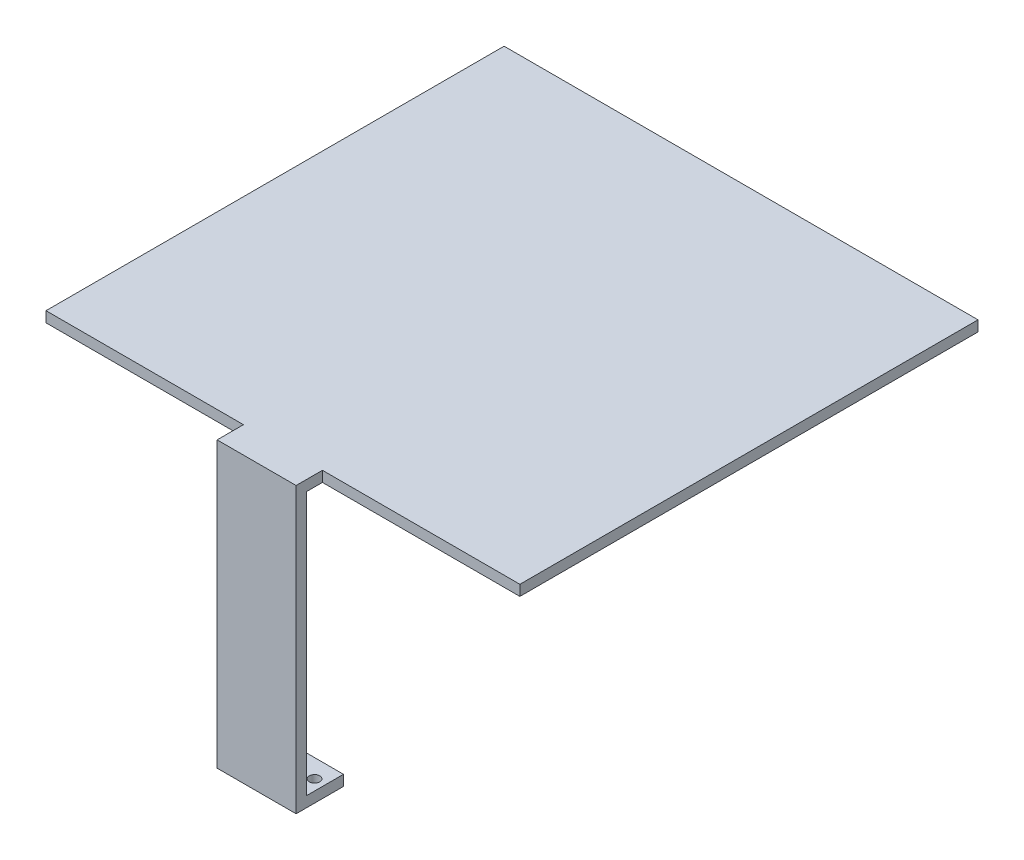
ISO-10303-21;
HEADER;
FILE_DESCRIPTION(('STEP AP214'),'2;1');
FILE_NAME('part.step','',(''),(''),'','','');
FILE_SCHEMA(('AUTOMOTIVE_DESIGN { 1 0 10303 214 1 1 1 1 }'));
ENDSEC;
DATA;
#1=APPLICATION_CONTEXT('core data for automotive mechanical design processes');
#2=APPLICATION_PROTOCOL_DEFINITION('international standard','automotive_design',2000,#1);
#3=PRODUCT_CONTEXT('',#1,'mechanical');
#4=PRODUCT('Part','Part','',(#3));
#5=PRODUCT_RELATED_PRODUCT_CATEGORY('part','',(#4));
#6=PRODUCT_DEFINITION_FORMATION('','',#4);
#7=PRODUCT_DEFINITION_CONTEXT('part definition',#1,'design');
#8=PRODUCT_DEFINITION('design','',#6,#7);
#9=PRODUCT_DEFINITION_SHAPE('','',#8);
#10=(LENGTH_UNIT() NAMED_UNIT(*) SI_UNIT(.MILLI.,.METRE.));
#11=(NAMED_UNIT(*) PLANE_ANGLE_UNIT() SI_UNIT($,.RADIAN.));
#12=(NAMED_UNIT(*) SI_UNIT($,.STERADIAN.) SOLID_ANGLE_UNIT());
#13=UNCERTAINTY_MEASURE_WITH_UNIT(LENGTH_MEASURE(1.E-05),#10,'distance_accuracy_value','');
#14=(GEOMETRIC_REPRESENTATION_CONTEXT(3) GLOBAL_UNCERTAINTY_ASSIGNED_CONTEXT((#13)) GLOBAL_UNIT_ASSIGNED_CONTEXT((#10,
#11,#12)) REPRESENTATION_CONTEXT('',''));
#15=CARTESIAN_POINT('',(0.,0.,0.));
#16=DIRECTION('',(0.,0.,1.));
#17=DIRECTION('',(1.,0.,0.));
#18=AXIS2_PLACEMENT_3D('',#15,#16,#17);
#19=CARTESIAN_POINT('',(7.5,-2.,9.));
#20=DIRECTION('',(0.,0.,1.));
#21=DIRECTION('',(1.,0.,0.));
#22=AXIS2_PLACEMENT_3D('',#19,#20,#21);
#23=PLANE('',#22);
#24=DIRECTION('',(0.,1.,0.));
#25=VECTOR('',#24,1.);
#26=CARTESIAN_POINT('',(-7.5,-2.,9.));
#27=LINE('',#26,#25);
#28=CARTESIAN_POINT('',(-7.5,-2.,9.));
#29=VERTEX_POINT('',#28);
#30=CARTESIAN_POINT('',(-7.5,52.,9.));
#31=VERTEX_POINT('',#30);
#32=EDGE_CURVE('E168',#29,#31,#27,.T.);
#33=ORIENTED_EDGE('',*,*,#32,.F.);
#34=DIRECTION('',(-1.,0.,0.));
#35=VECTOR('',#34,1.);
#36=CARTESIAN_POINT('',(7.5,-2.,9.));
#37=LINE('',#36,#35);
#38=CARTESIAN_POINT('',(7.5,-2.,9.));
#39=VERTEX_POINT('',#38);
#40=EDGE_CURVE('E40',#39,#29,#37,.T.);
#41=ORIENTED_EDGE('',*,*,#40,.F.);
#42=DIRECTION('',(0.,1.,0.));
#43=VECTOR('',#42,1.);
#44=CARTESIAN_POINT('',(7.5,-2.,9.));
#45=LINE('',#44,#43);
#46=CARTESIAN_POINT('',(7.5,52.,9.));
#47=VERTEX_POINT('',#46);
#48=EDGE_CURVE('E169',#39,#47,#45,.T.);
#49=ORIENTED_EDGE('',*,*,#48,.T.);
#50=DIRECTION('',(-1.,0.,0.));
#51=VECTOR('',#50,1.);
#52=CARTESIAN_POINT('',(7.5,52.,9.));
#53=LINE('',#52,#51);
#54=EDGE_CURVE('E187',#47,#31,#53,.T.);
#55=ORIENTED_EDGE('',*,*,#54,.T.);
#56=EDGE_LOOP('',(#33,#41,#49,#55));
#57=FACE_BOUND('',#56,.T.);
#58=ADVANCED_FACE('F33',(#57),#23,.T.);
#59=CARTESIAN_POINT('',(7.5,-2.,0.));
#60=DIRECTION('',(0.,-1.,0.));
#61=DIRECTION('',(0.,0.,-1.));
#62=AXIS2_PLACEMENT_3D('',#59,#60,#61);
#63=PLANE('',#62);
#64=CARTESIAN_POINT('',(-5.5,-2.,3.5));
#65=DIRECTION('',(0.,1.,0.));
#66=DIRECTION('',(0.,0.,1.));
#67=AXIS2_PLACEMENT_3D('',#64,#65,#66);
#68=CIRCLE('',#67,1.);
#69=CARTESIAN_POINT('',(-5.5,-2.,4.5));
#70=VERTEX_POINT('',#69);
#71=EDGE_CURVE('E161',#70,#70,#68,.T.);
#72=ORIENTED_EDGE('',*,*,#71,.T.);
#73=EDGE_LOOP('',(#72));
#74=FACE_BOUND('',#73,.T.);
#75=CARTESIAN_POINT('',(5.5,-2.,3.5));
#76=DIRECTION('',(0.,1.,0.));
#77=DIRECTION('',(0.,0.,-1.));
#78=AXIS2_PLACEMENT_3D('',#75,#76,#77);
#79=CIRCLE('',#78,1.);
#80=CARTESIAN_POINT('',(5.5,-2.,2.5));
#81=VERTEX_POINT('',#80);
#82=EDGE_CURVE('E398',#81,#81,#79,.T.);
#83=ORIENTED_EDGE('',*,*,#82,.T.);
#84=EDGE_LOOP('',(#83));
#85=FACE_BOUND('',#84,.T.);
#86=DIRECTION('',(0.,0.,1.));
#87=VECTOR('',#86,1.);
#88=CARTESIAN_POINT('',(-7.5,-2.,0.));
#89=LINE('',#88,#87);
#90=CARTESIAN_POINT('',(-7.5,-2.,0.));
#91=VERTEX_POINT('',#90);
#92=EDGE_CURVE('E173',#91,#29,#89,.T.);
#93=ORIENTED_EDGE('',*,*,#92,.F.);
#94=DIRECTION('',(-1.,0.,0.));
#95=VECTOR('',#94,1.);
#96=CARTESIAN_POINT('',(7.5,-2.,0.));
#97=LINE('',#96,#95);
#98=CARTESIAN_POINT('',(7.5,-2.,0.));
#99=VERTEX_POINT('',#98);
#100=EDGE_CURVE('E201',#99,#91,#97,.T.);
#101=ORIENTED_EDGE('',*,*,#100,.F.);
#102=DIRECTION('',(0.,0.,1.));
#103=VECTOR('',#102,1.);
#104=CARTESIAN_POINT('',(7.5,-2.,0.));
#105=LINE('',#104,#103);
#106=EDGE_CURVE('E184',#99,#39,#105,.T.);
#107=ORIENTED_EDGE('',*,*,#106,.T.);
#108=ORIENTED_EDGE('',*,*,#40,.T.);
#109=EDGE_LOOP('',(#93,#101,#107,#108));
#110=FACE_BOUND('',#109,.T.);
#111=ADVANCED_FACE('F227',(#74,#85,#110),#63,.T.);
#112=CARTESIAN_POINT('',(7.5,-2.,0.));
#113=DIRECTION('',(0.,0.,1.));
#114=DIRECTION('',(1.,0.,0.));
#115=AXIS2_PLACEMENT_3D('',#112,#113,#114);
#116=PLANE('',#115);
#117=DIRECTION('',(0.,1.,0.));
#118=VECTOR('',#117,1.);
#119=CARTESIAN_POINT('',(-7.5,-2.,0.));
#120=LINE('',#119,#118);
#121=CARTESIAN_POINT('',(-7.5,0.,0.));
#122=VERTEX_POINT('',#121);
#123=EDGE_CURVE('E196',#91,#122,#120,.T.);
#124=ORIENTED_EDGE('',*,*,#123,.T.);
#125=DIRECTION('',(-1.,0.,0.));
#126=VECTOR('',#125,1.);
#127=CARTESIAN_POINT('',(7.5,0.,0.));
#128=LINE('',#127,#126);
#129=CARTESIAN_POINT('',(7.5,0.,0.));
#130=VERTEX_POINT('',#129);
#131=EDGE_CURVE('E203',#130,#122,#128,.T.);
#132=ORIENTED_EDGE('',*,*,#131,.F.);
#133=DIRECTION('',(0.,1.,0.));
#134=VECTOR('',#133,1.);
#135=CARTESIAN_POINT('',(7.5,-2.,0.));
#136=LINE('',#135,#134);
#137=EDGE_CURVE('E182',#99,#130,#136,.T.);
#138=ORIENTED_EDGE('',*,*,#137,.F.);
#139=ORIENTED_EDGE('',*,*,#100,.T.);
#140=EDGE_LOOP('',(#124,#132,#138,#139));
#141=FACE_BOUND('',#140,.T.);
#142=ADVANCED_FACE('F253',(#141),#116,.F.);
#143=CARTESIAN_POINT('',(7.5,0.,0.));
#144=DIRECTION('',(0.,-1.,0.));
#145=DIRECTION('',(0.,0.,-1.));
#146=AXIS2_PLACEMENT_3D('',#143,#144,#145);
#147=PLANE('',#146);
#148=CARTESIAN_POINT('',(-5.5,0.,3.5));
#149=DIRECTION('',(0.,1.,0.));
#150=DIRECTION('',(0.,0.,1.));
#151=AXIS2_PLACEMENT_3D('',#148,#149,#150);
#152=CIRCLE('',#151,1.);
#153=CARTESIAN_POINT('',(-5.5,0.,4.5));
#154=VERTEX_POINT('',#153);
#155=EDGE_CURVE('E397',#154,#154,#152,.T.);
#156=ORIENTED_EDGE('',*,*,#155,.F.);
#157=EDGE_LOOP('',(#156));
#158=FACE_BOUND('',#157,.T.);
#159=CARTESIAN_POINT('',(5.5,0.,3.5));
#160=DIRECTION('',(0.,1.,0.));
#161=DIRECTION('',(0.,0.,-1.));
#162=AXIS2_PLACEMENT_3D('',#159,#160,#161);
#163=CIRCLE('',#162,1.);
#164=CARTESIAN_POINT('',(5.5,0.,2.5));
#165=VERTEX_POINT('',#164);
#166=EDGE_CURVE('E151',#165,#165,#163,.T.);
#167=ORIENTED_EDGE('',*,*,#166,.F.);
#168=EDGE_LOOP('',(#167));
#169=FACE_BOUND('',#168,.T.);
#170=DIRECTION('',(0.,0.,1.));
#171=VECTOR('',#170,1.);
#172=CARTESIAN_POINT('',(-7.5,0.,0.));
#173=LINE('',#172,#171);
#174=CARTESIAN_POINT('',(-7.5,0.,7.));
#175=VERTEX_POINT('',#174);
#176=EDGE_CURVE('E194',#122,#175,#173,.T.);
#177=ORIENTED_EDGE('',*,*,#176,.T.);
#178=DIRECTION('',(-1.,0.,0.));
#179=VECTOR('',#178,1.);
#180=CARTESIAN_POINT('',(7.5,0.,7.));
#181=LINE('',#180,#179);
#182=CARTESIAN_POINT('',(7.5,0.,7.));
#183=VERTEX_POINT('',#182);
#184=EDGE_CURVE('E206',#183,#175,#181,.T.);
#185=ORIENTED_EDGE('',*,*,#184,.F.);
#186=DIRECTION('',(0.,0.,1.));
#187=VECTOR('',#186,1.);
#188=CARTESIAN_POINT('',(7.5,0.,0.));
#189=LINE('',#188,#187);
#190=EDGE_CURVE('E180',#130,#183,#189,.T.);
#191=ORIENTED_EDGE('',*,*,#190,.F.);
#192=ORIENTED_EDGE('',*,*,#131,.T.);
#193=EDGE_LOOP('',(#177,#185,#191,#192));
#194=FACE_BOUND('',#193,.T.);
#195=ADVANCED_FACE('F250',(#158,#169,#194),#147,.F.);
#196=CARTESIAN_POINT('',(7.5,0.,7.));
#197=DIRECTION('',(0.,0.,1.));
#198=DIRECTION('',(1.,0.,0.));
#199=AXIS2_PLACEMENT_3D('',#196,#197,#198);
#200=PLANE('',#199);
#201=DIRECTION('',(0.,1.,0.));
#202=VECTOR('',#201,1.);
#203=CARTESIAN_POINT('',(-7.5,0.,7.));
#204=LINE('',#203,#202);
#205=CARTESIAN_POINT('',(-7.5,50.,7.));
#206=VERTEX_POINT('',#205);
#207=EDGE_CURVE('E192',#175,#206,#204,.T.);
#208=ORIENTED_EDGE('',*,*,#207,.T.);
#209=DIRECTION('',(-1.,0.,0.));
#210=VECTOR('',#209,1.);
#211=CARTESIAN_POINT('',(7.5,50.,7.));
#212=LINE('',#211,#210);
#213=CARTESIAN_POINT('',(7.5,50.,7.));
#214=VERTEX_POINT('',#213);
#215=EDGE_CURVE('E209',#214,#206,#212,.T.);
#216=ORIENTED_EDGE('',*,*,#215,.F.);
#217=DIRECTION('',(0.,1.,0.));
#218=VECTOR('',#217,1.);
#219=CARTESIAN_POINT('',(7.5,0.,7.));
#220=LINE('',#219,#218);
#221=EDGE_CURVE('E178',#183,#214,#220,.T.);
#222=ORIENTED_EDGE('',*,*,#221,.F.);
#223=ORIENTED_EDGE('',*,*,#184,.T.);
#224=EDGE_LOOP('',(#208,#216,#222,#223));
#225=FACE_BOUND('',#224,.T.);
#226=ADVANCED_FACE('F245',(#225),#200,.F.);
#227=CARTESIAN_POINT('',(7.5,50.,7.));
#228=DIRECTION('',(0.,1.,0.));
#229=DIRECTION('',(0.,0.,1.));
#230=AXIS2_PLACEMENT_3D('',#227,#228,#229);
#231=PLANE('',#230);
#232=DIRECTION('',(0.,0.,-1.));
#233=VECTOR('',#232,1.);
#234=CARTESIAN_POINT('',(-7.5,50.,7.));
#235=LINE('',#234,#233);
#236=CARTESIAN_POINT('',(-7.5,50.,4.));
#237=VERTEX_POINT('',#236);
#238=EDGE_CURVE('E190',#206,#237,#235,.T.);
#239=ORIENTED_EDGE('',*,*,#238,.T.);
#240=DIRECTION('',(-1.,0.,0.));
#241=VECTOR('',#240,1.);
#242=CARTESIAN_POINT('',(45.,50.,4.));
#243=LINE('',#242,#241);
#244=CARTESIAN_POINT('',(-45.,50.,4.));
#245=VERTEX_POINT('',#244);
#246=EDGE_CURVE('E130',#237,#245,#243,.T.);
#247=ORIENTED_EDGE('',*,*,#246,.T.);
#248=DIRECTION('',(0.,0.,-1.));
#249=VECTOR('',#248,1.);
#250=CARTESIAN_POINT('',(-45.,50.,0.));
#251=LINE('',#250,#249);
#252=CARTESIAN_POINT('',(-45.,50.,-83.));
#253=VERTEX_POINT('',#252);
#254=EDGE_CURVE('E160',#245,#253,#251,.T.);
#255=ORIENTED_EDGE('',*,*,#254,.T.);
#256=DIRECTION('',(-1.,0.,0.));
#257=VECTOR('',#256,1.);
#258=CARTESIAN_POINT('',(7.5,50.,-83.));
#259=LINE('',#258,#257);
#260=CARTESIAN_POINT('',(45.,50.,-83.));
#261=VERTEX_POINT('',#260);
#262=EDGE_CURVE('E136',#261,#253,#259,.T.);
#263=ORIENTED_EDGE('',*,*,#262,.F.);
#264=DIRECTION('',(0.,0.,-1.));
#265=VECTOR('',#264,1.);
#266=CARTESIAN_POINT('',(45.,50.,0.));
#267=LINE('',#266,#265);
#268=CARTESIAN_POINT('',(45.,50.,4.));
#269=VERTEX_POINT('',#268);
#270=EDGE_CURVE('E133',#269,#261,#267,.T.);
#271=ORIENTED_EDGE('',*,*,#270,.F.);
#272=CARTESIAN_POINT('',(7.50000000000001,50.,4.));
#273=VERTEX_POINT('',#272);
#274=EDGE_CURVE('E119',#269,#273,#243,.T.);
#275=ORIENTED_EDGE('',*,*,#274,.T.);
#276=DIRECTION('',(0.,0.,-1.));
#277=VECTOR('',#276,1.);
#278=CARTESIAN_POINT('',(7.5,50.,7.));
#279=LINE('',#278,#277);
#280=EDGE_CURVE('E176',#214,#273,#279,.T.);
#281=ORIENTED_EDGE('',*,*,#280,.F.);
#282=ORIENTED_EDGE('',*,*,#215,.T.);
#283=EDGE_LOOP('',(#239,#247,#255,#263,#271,#275,#281,#282));
#284=FACE_BOUND('',#283,.T.);
#285=ADVANCED_FACE('F134',(#284),#231,.F.);
#286=CARTESIAN_POINT('',(7.5,52.,-83.));
#287=DIRECTION('',(0.,0.,-1.));
#288=DIRECTION('',(-1.,0.,0.));
#289=AXIS2_PLACEMENT_3D('',#286,#287,#288);
#290=PLANE('',#289);
#291=ORIENTED_EDGE('',*,*,#262,.T.);
#292=DIRECTION('',(0.,-1.,0.));
#293=VECTOR('',#292,1.);
#294=CARTESIAN_POINT('',(-45.,0.,-83.));
#295=LINE('',#294,#293);
#296=CARTESIAN_POINT('',(-45.,52.,-83.));
#297=VERTEX_POINT('',#296);
#298=EDGE_CURVE('E148',#297,#253,#295,.T.);
#299=ORIENTED_EDGE('',*,*,#298,.F.);
#300=DIRECTION('',(-1.,0.,0.));
#301=VECTOR('',#300,1.);
#302=CARTESIAN_POINT('',(7.5,52.,-83.));
#303=LINE('',#302,#301);
#304=CARTESIAN_POINT('',(45.,52.,-83.));
#305=VERTEX_POINT('',#304);
#306=EDGE_CURVE('E213',#305,#297,#303,.T.);
#307=ORIENTED_EDGE('',*,*,#306,.F.);
#308=DIRECTION('',(0.,-1.,0.));
#309=VECTOR('',#308,1.);
#310=CARTESIAN_POINT('',(45.,0.,-83.));
#311=LINE('',#310,#309);
#312=EDGE_CURVE('E140',#305,#261,#311,.T.);
#313=ORIENTED_EDGE('',*,*,#312,.T.);
#314=EDGE_LOOP('',(#291,#299,#307,#313));
#315=FACE_BOUND('',#314,.T.);
#316=ADVANCED_FACE('F234',(#315),#290,.T.);
#317=CARTESIAN_POINT('',(7.5,52.,9.));
#318=DIRECTION('',(0.,1.,0.));
#319=DIRECTION('',(0.,0.,1.));
#320=AXIS2_PLACEMENT_3D('',#317,#318,#319);
#321=PLANE('',#320);
#322=DIRECTION('',(0.,0.,-1.));
#323=VECTOR('',#322,1.);
#324=CARTESIAN_POINT('',(7.5,52.,9.));
#325=LINE('',#324,#323);
#326=CARTESIAN_POINT('',(7.50000000000001,52.,4.));
#327=VERTEX_POINT('',#326);
#328=EDGE_CURVE('E172',#47,#327,#325,.T.);
#329=ORIENTED_EDGE('',*,*,#328,.T.);
#330=DIRECTION('',(-1.,0.,0.));
#331=VECTOR('',#330,1.);
#332=CARTESIAN_POINT('',(45.,52.,4.));
#333=LINE('',#332,#331);
#334=CARTESIAN_POINT('',(45.,52.,4.));
#335=VERTEX_POINT('',#334);
#336=EDGE_CURVE('E165',#335,#327,#333,.T.);
#337=ORIENTED_EDGE('',*,*,#336,.F.);
#338=DIRECTION('',(0.,0.,-1.));
#339=VECTOR('',#338,1.);
#340=CARTESIAN_POINT('',(45.,52.,0.));
#341=LINE('',#340,#339);
#342=EDGE_CURVE('E144',#335,#305,#341,.T.);
#343=ORIENTED_EDGE('',*,*,#342,.T.);
#344=ORIENTED_EDGE('',*,*,#306,.T.);
#345=DIRECTION('',(0.,0.,-1.));
#346=VECTOR('',#345,1.);
#347=CARTESIAN_POINT('',(-45.,52.,0.));
#348=LINE('',#347,#346);
#349=CARTESIAN_POINT('',(-45.,52.,4.));
#350=VERTEX_POINT('',#349);
#351=EDGE_CURVE('E145',#350,#297,#348,.T.);
#352=ORIENTED_EDGE('',*,*,#351,.F.);
#353=CARTESIAN_POINT('',(-7.5,52.,4.));
#354=VERTEX_POINT('',#353);
#355=EDGE_CURVE('E156',#354,#350,#333,.T.);
#356=ORIENTED_EDGE('',*,*,#355,.F.);
#357=DIRECTION('',(0.,0.,-1.));
#358=VECTOR('',#357,1.);
#359=CARTESIAN_POINT('',(-7.5,52.,9.));
#360=LINE('',#359,#358);
#361=EDGE_CURVE('E50',#31,#354,#360,.T.);
#362=ORIENTED_EDGE('',*,*,#361,.F.);
#363=ORIENTED_EDGE('',*,*,#54,.F.);
#364=EDGE_LOOP('',(#329,#337,#343,#344,#352,#356,#362,#363));
#365=FACE_BOUND('',#364,.T.);
#366=ADVANCED_FACE('F220',(#365),#321,.T.);
#367=CARTESIAN_POINT('',(7.5,0.,0.));
#368=DIRECTION('',(-1.,0.,0.));
#369=DIRECTION('',(0.,0.,1.));
#370=AXIS2_PLACEMENT_3D('',#367,#368,#369);
#371=PLANE('',#370);
#372=ORIENTED_EDGE('',*,*,#280,.T.);
#373=DIRECTION('',(0.,1.,0.));
#374=VECTOR('',#373,1.);
#375=CARTESIAN_POINT('',(7.5,0.,4.));
#376=LINE('',#375,#374);
#377=EDGE_CURVE('E126',#273,#327,#376,.T.);
#378=ORIENTED_EDGE('',*,*,#377,.T.);
#379=ORIENTED_EDGE('',*,*,#328,.F.);
#380=ORIENTED_EDGE('',*,*,#48,.F.);
#381=ORIENTED_EDGE('',*,*,#106,.F.);
#382=ORIENTED_EDGE('',*,*,#137,.T.);
#383=ORIENTED_EDGE('',*,*,#190,.T.);
#384=ORIENTED_EDGE('',*,*,#221,.T.);
#385=EDGE_LOOP('',(#372,#378,#379,#380,#381,#382,#383,#384));
#386=FACE_BOUND('',#385,.T.);
#387=ADVANCED_FACE('F231',(#386),#371,.F.);
#388=CARTESIAN_POINT('',(-7.5,0.,0.));
#389=DIRECTION('',(-1.,0.,0.));
#390=DIRECTION('',(0.,0.,1.));
#391=AXIS2_PLACEMENT_3D('',#388,#389,#390);
#392=PLANE('',#391);
#393=DIRECTION('',(0.,1.,0.));
#394=VECTOR('',#393,1.);
#395=CARTESIAN_POINT('',(-7.5,0.,4.));
#396=LINE('',#395,#394);
#397=EDGE_CURVE('E11',#237,#354,#396,.T.);
#398=ORIENTED_EDGE('',*,*,#397,.F.);
#399=ORIENTED_EDGE('',*,*,#238,.F.);
#400=ORIENTED_EDGE('',*,*,#207,.F.);
#401=ORIENTED_EDGE('',*,*,#176,.F.);
#402=ORIENTED_EDGE('',*,*,#123,.F.);
#403=ORIENTED_EDGE('',*,*,#92,.T.);
#404=ORIENTED_EDGE('',*,*,#32,.T.);
#405=ORIENTED_EDGE('',*,*,#361,.T.);
#406=EDGE_LOOP('',(#398,#399,#400,#401,#402,#403,#404,#405));
#407=FACE_BOUND('',#406,.T.);
#408=ADVANCED_FACE('F222',(#407),#392,.T.);
#409=CARTESIAN_POINT('',(-45.,0.,0.));
#410=DIRECTION('',(1.,0.,0.));
#411=DIRECTION('',(0.,0.,-1.));
#412=AXIS2_PLACEMENT_3D('',#409,#410,#411);
#413=PLANE('',#412);
#414=DIRECTION('',(0.,1.,0.));
#415=VECTOR('',#414,1.);
#416=CARTESIAN_POINT('',(-45.,0.,4.));
#417=LINE('',#416,#415);
#418=EDGE_CURVE('E157',#245,#350,#417,.T.);
#419=ORIENTED_EDGE('',*,*,#418,.T.);
#420=ORIENTED_EDGE('',*,*,#351,.T.);
#421=ORIENTED_EDGE('',*,*,#298,.T.);
#422=ORIENTED_EDGE('',*,*,#254,.F.);
#423=EDGE_LOOP('',(#419,#420,#421,#422));
#424=FACE_BOUND('',#423,.T.);
#425=ADVANCED_FACE('F237',(#424),#413,.F.);
#426=CARTESIAN_POINT('',(45.,0.,4.));
#427=DIRECTION('',(0.,0.,1.));
#428=DIRECTION('',(1.,0.,0.));
#429=AXIS2_PLACEMENT_3D('',#426,#427,#428);
#430=PLANE('',#429);
#431=ORIENTED_EDGE('',*,*,#246,.F.);
#432=ORIENTED_EDGE('',*,*,#397,.T.);
#433=ORIENTED_EDGE('',*,*,#355,.T.);
#434=ORIENTED_EDGE('',*,*,#418,.F.);
#435=EDGE_LOOP('',(#431,#432,#433,#434));
#436=FACE_BOUND('',#435,.T.);
#437=ADVANCED_FACE('F241',(#436),#430,.T.);
#438=ORIENTED_EDGE('',*,*,#377,.F.);
#439=ORIENTED_EDGE('',*,*,#274,.F.);
#440=DIRECTION('',(0.,1.,0.));
#441=VECTOR('',#440,1.);
#442=CARTESIAN_POINT('',(45.,0.,4.));
#443=LINE('',#442,#441);
#444=EDGE_CURVE('E123',#269,#335,#443,.T.);
#445=ORIENTED_EDGE('',*,*,#444,.T.);
#446=ORIENTED_EDGE('',*,*,#336,.T.);
#447=EDGE_LOOP('',(#438,#439,#445,#446));
#448=FACE_BOUND('',#447,.T.);
#449=ADVANCED_FACE('F121',(#448),#430,.T.);
#450=CARTESIAN_POINT('',(45.,0.,0.));
#451=DIRECTION('',(1.,0.,0.));
#452=DIRECTION('',(0.,0.,-1.));
#453=AXIS2_PLACEMENT_3D('',#450,#451,#452);
#454=PLANE('',#453);
#455=ORIENTED_EDGE('',*,*,#444,.F.);
#456=ORIENTED_EDGE('',*,*,#270,.T.);
#457=ORIENTED_EDGE('',*,*,#312,.F.);
#458=ORIENTED_EDGE('',*,*,#342,.F.);
#459=EDGE_LOOP('',(#455,#456,#457,#458));
#460=FACE_BOUND('',#459,.T.);
#461=ADVANCED_FACE('F142',(#460),#454,.T.);
#462=CARTESIAN_POINT('',(5.5,-2.,3.5));
#463=DIRECTION('',(0.,1.,0.));
#464=DIRECTION('',(0.,0.,1.));
#465=AXIS2_PLACEMENT_3D('',#462,#463,#464);
#466=CYLINDRICAL_SURFACE('',#465,1.);
#467=ORIENTED_EDGE('',*,*,#82,.F.);
#468=EDGE_LOOP('',(#467));
#469=FACE_BOUND('',#468,.T.);
#470=ORIENTED_EDGE('',*,*,#166,.T.);
#471=EDGE_LOOP('',(#470));
#472=FACE_BOUND('',#471,.T.);
#473=ADVANCED_FACE('F287',(#469,#472),#466,.F.);
#474=CARTESIAN_POINT('',(-5.5,-2.,3.5));
#475=DIRECTION('',(0.,1.,0.));
#476=DIRECTION('',(0.,0.,1.));
#477=AXIS2_PLACEMENT_3D('',#474,#475,#476);
#478=CYLINDRICAL_SURFACE('',#477,1.);
#479=ORIENTED_EDGE('',*,*,#71,.F.);
#480=EDGE_LOOP('',(#479));
#481=FACE_BOUND('',#480,.T.);
#482=ORIENTED_EDGE('',*,*,#155,.T.);
#483=EDGE_LOOP('',(#482));
#484=FACE_BOUND('',#483,.T.);
#485=ADVANCED_FACE('F292',(#481,#484),#478,.F.);
#486=CLOSED_SHELL('',(#58,#111,#142,#195,#226,#285,#316,#366,#387,#408,#425,#437,#449,#461,#473,#485));
#487=MANIFOLD_SOLID_BREP('B2',#486);
#488=ADVANCED_BREP_SHAPE_REPRESENTATION('',(#18,#487),#14);
#489=SHAPE_DEFINITION_REPRESENTATION(#9,#488);
ENDSEC;
END-ISO-10303-21;
